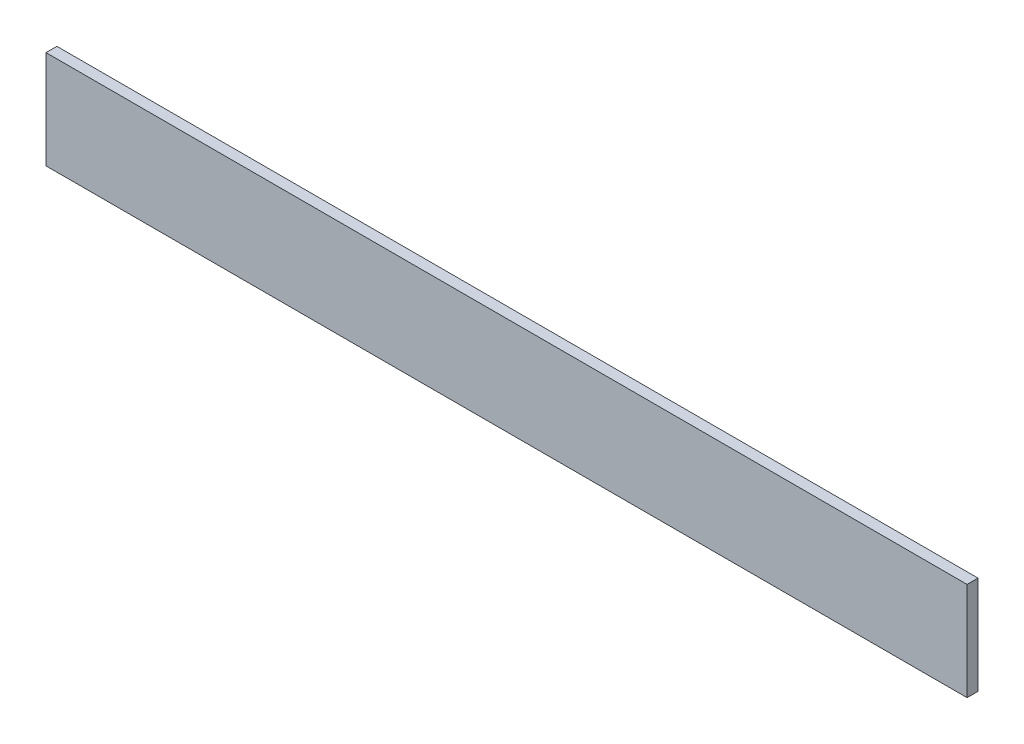
ISO-10303-21;
HEADER;
FILE_DESCRIPTION(('STEP AP214'),'2;1');
FILE_NAME('part.step','',(''),(''),'','','');
FILE_SCHEMA(('AUTOMOTIVE_DESIGN { 1 0 10303 214 1 1 1 1 }'));
ENDSEC;
DATA;
#1=APPLICATION_CONTEXT('core data for automotive mechanical design processes');
#2=APPLICATION_PROTOCOL_DEFINITION('international standard','automotive_design',2000,#1);
#3=PRODUCT_CONTEXT('',#1,'mechanical');
#4=PRODUCT('Part','Part','',(#3));
#5=PRODUCT_RELATED_PRODUCT_CATEGORY('part','',(#4));
#6=PRODUCT_DEFINITION_FORMATION('','',#4);
#7=PRODUCT_DEFINITION_CONTEXT('part definition',#1,'design');
#8=PRODUCT_DEFINITION('design','',#6,#7);
#9=PRODUCT_DEFINITION_SHAPE('','',#8);
#10=(LENGTH_UNIT() NAMED_UNIT(*) SI_UNIT(.MILLI.,.METRE.));
#11=(NAMED_UNIT(*) PLANE_ANGLE_UNIT() SI_UNIT($,.RADIAN.));
#12=(NAMED_UNIT(*) SI_UNIT($,.STERADIAN.) SOLID_ANGLE_UNIT());
#13=UNCERTAINTY_MEASURE_WITH_UNIT(LENGTH_MEASURE(1.E-05),#10,'distance_accuracy_value','');
#14=(GEOMETRIC_REPRESENTATION_CONTEXT(3) GLOBAL_UNCERTAINTY_ASSIGNED_CONTEXT((#13)) GLOBAL_UNIT_ASSIGNED_CONTEXT((#10,
#11,#12)) REPRESENTATION_CONTEXT('',''));
#15=CARTESIAN_POINT('',(0.,0.,0.));
#16=DIRECTION('',(0.,0.,1.));
#17=DIRECTION('',(1.,0.,0.));
#18=AXIS2_PLACEMENT_3D('',#15,#16,#17);
#19=CARTESIAN_POINT('',(84.5,8.99999999999962,2.00000000000047));
#20=DIRECTION('',(-1.,0.,0.));
#21=DIRECTION('',(0.,0.,1.00000000000001));
#22=AXIS2_PLACEMENT_3D('',#19,#20,#21);
#23=PLANE('',#22);
#24=DIRECTION('',(0.,1.00000000000001,0.));
#25=VECTOR('',#24,1.);
#26=CARTESIAN_POINT('',(84.5,8.99999999999882,4.44089209850063E-13));
#27=LINE('',#26,#25);
#28=CARTESIAN_POINT('',(84.5,-9.00000000000106,-3.33066907387547E-13));
#29=VERTEX_POINT('',#28);
#30=CARTESIAN_POINT('',(84.5,8.99999999999882,4.44089209850063E-13));
#31=VERTEX_POINT('',#30);
#32=EDGE_CURVE('E100',#29,#31,#27,.T.);
#33=ORIENTED_EDGE('',*,*,#32,.T.);
#34=DIRECTION('',(0.,0.,-1.00000000000001));
#35=VECTOR('',#34,1.);
#36=CARTESIAN_POINT('',(84.5,8.99999999999962,2.00000000000047));
#37=LINE('',#36,#35);
#38=CARTESIAN_POINT('',(84.5,8.99999999999962,2.00000000000047));
#39=VERTEX_POINT('',#38);
#40=EDGE_CURVE('E11',#39,#31,#37,.T.);
#41=ORIENTED_EDGE('',*,*,#40,.F.);
#42=DIRECTION('',(0.,1.00000000000001,0.));
#43=VECTOR('',#42,1.);
#44=CARTESIAN_POINT('',(84.5,8.99999999999962,2.00000000000047));
#45=LINE('',#44,#43);
#46=CARTESIAN_POINT('',(84.5,-9.00000000000048,2.00000000000006));
#47=VERTEX_POINT('',#46);
#48=EDGE_CURVE('E88',#47,#39,#45,.T.);
#49=ORIENTED_EDGE('',*,*,#48,.F.);
#50=DIRECTION('',(0.,0.,-1.00000000000001));
#51=VECTOR('',#50,1.);
#52=CARTESIAN_POINT('',(84.5,-9.00000000000048,2.00000000000006));
#53=LINE('',#52,#51);
#54=EDGE_CURVE('E96',#47,#29,#53,.T.);
#55=ORIENTED_EDGE('',*,*,#54,.T.);
#56=EDGE_LOOP('',(#33,#41,#49,#55));
#57=FACE_BOUND('',#56,.T.);
#58=ADVANCED_FACE('F37',(#57),#23,.F.);
#59=CARTESIAN_POINT('',(-84.5000000000001,8.99999999999951,2.00000000000009));
#60=DIRECTION('',(0.,-1.00000000000001,0.));
#61=DIRECTION('',(0.,0.,-1.00000000000001));
#62=AXIS2_PLACEMENT_3D('',#59,#60,#61);
#63=PLANE('',#62);
#64=DIRECTION('',(-1.,0.,0.));
#65=VECTOR('',#64,1.);
#66=CARTESIAN_POINT('',(-84.5,8.99999999999848,2.22044604925031E-13));
#67=LINE('',#66,#65);
#68=CARTESIAN_POINT('',(-84.5,8.99999999999848,2.22044604925031E-13));
#69=VERTEX_POINT('',#68);
#70=EDGE_CURVE('E92',#31,#69,#67,.T.);
#71=ORIENTED_EDGE('',*,*,#70,.T.);
#72=DIRECTION('',(0.,0.,-1.00000000000001));
#73=VECTOR('',#72,1.);
#74=CARTESIAN_POINT('',(-84.5000000000001,8.99999999999951,2.00000000000009));
#75=LINE('',#74,#73);
#76=CARTESIAN_POINT('',(-84.5000000000001,8.99999999999951,2.00000000000009));
#77=VERTEX_POINT('',#76);
#78=EDGE_CURVE('E45',#77,#69,#75,.T.);
#79=ORIENTED_EDGE('',*,*,#78,.F.);
#80=DIRECTION('',(-1.,0.,0.));
#81=VECTOR('',#80,1.);
#82=CARTESIAN_POINT('',(-84.5000000000001,8.99999999999951,2.00000000000009));
#83=LINE('',#82,#81);
#84=EDGE_CURVE('E83',#39,#77,#83,.T.);
#85=ORIENTED_EDGE('',*,*,#84,.F.);
#86=ORIENTED_EDGE('',*,*,#40,.T.);
#87=EDGE_LOOP('',(#71,#79,#85,#86));
#88=FACE_BOUND('',#87,.T.);
#89=ADVANCED_FACE('F91',(#88),#63,.F.);
#90=CARTESIAN_POINT('',(-84.5000000000001,8.99999999999951,2.00000000000009));
#91=DIRECTION('',(1.,0.,0.));
#92=DIRECTION('',(0.,0.,-1.00000000000001));
#93=AXIS2_PLACEMENT_3D('',#90,#91,#92);
#94=PLANE('',#93);
#95=DIRECTION('',(0.,-1.00000000000001,0.));
#96=VECTOR('',#95,1.);
#97=CARTESIAN_POINT('',(-84.5,8.99999999999848,2.22044604925031E-13));
#98=LINE('',#97,#96);
#99=CARTESIAN_POINT('',(-84.5,-9.00000000000112,-4.44089209850063E-13));
#100=VERTEX_POINT('',#99);
#101=EDGE_CURVE('E70',#69,#100,#98,.T.);
#102=ORIENTED_EDGE('',*,*,#101,.T.);
#103=DIRECTION('',(0.,0.,-1.00000000000001));
#104=VECTOR('',#103,1.);
#105=CARTESIAN_POINT('',(-84.5,-9.00000000000053,1.99999999999989));
#106=LINE('',#105,#104);
#107=CARTESIAN_POINT('',(-84.5,-9.00000000000053,1.99999999999989));
#108=VERTEX_POINT('',#107);
#109=EDGE_CURVE('E93',#108,#100,#106,.T.);
#110=ORIENTED_EDGE('',*,*,#109,.F.);
#111=DIRECTION('',(0.,-1.00000000000001,0.));
#112=VECTOR('',#111,1.);
#113=CARTESIAN_POINT('',(-84.5000000000001,8.99999999999951,2.00000000000009));
#114=LINE('',#113,#112);
#115=EDGE_CURVE('E86',#77,#108,#114,.T.);
#116=ORIENTED_EDGE('',*,*,#115,.F.);
#117=ORIENTED_EDGE('',*,*,#78,.T.);
#118=EDGE_LOOP('',(#102,#110,#116,#117));
#119=FACE_BOUND('',#118,.T.);
#120=ADVANCED_FACE('F94',(#119),#94,.F.);
#121=CARTESIAN_POINT('',(-84.5,-9.00000000000053,1.99999999999989));
#122=DIRECTION('',(0.,1.00000000000001,0.));
#123=DIRECTION('',(0.,0.,1.00000000000001));
#124=AXIS2_PLACEMENT_3D('',#121,#122,#123);
#125=PLANE('',#124);
#126=DIRECTION('',(1.,0.,0.));
#127=VECTOR('',#126,1.);
#128=CARTESIAN_POINT('',(-84.5,-9.00000000000112,-4.44089209850063E-13));
#129=LINE('',#128,#127);
#130=EDGE_CURVE('E76',#100,#29,#129,.T.);
#131=ORIENTED_EDGE('',*,*,#130,.T.);
#132=ORIENTED_EDGE('',*,*,#54,.F.);
#133=DIRECTION('',(1.,0.,0.));
#134=VECTOR('',#133,1.);
#135=CARTESIAN_POINT('',(-84.5,-9.00000000000053,1.99999999999989));
#136=LINE('',#135,#134);
#137=EDGE_CURVE('E53',#108,#47,#136,.T.);
#138=ORIENTED_EDGE('',*,*,#137,.F.);
#139=ORIENTED_EDGE('',*,*,#109,.T.);
#140=EDGE_LOOP('',(#131,#132,#138,#139));
#141=FACE_BOUND('',#140,.T.);
#142=ADVANCED_FACE('F107',(#141),#125,.F.);
#143=CARTESIAN_POINT('',(0.,-5.55111512312578E-13,1.99999999999995));
#144=DIRECTION('',(0.,0.,1.00000000000001));
#145=DIRECTION('',(1.,0.,0.));
#146=AXIS2_PLACEMENT_3D('',#143,#144,#145);
#147=PLANE('',#146);
#148=ORIENTED_EDGE('',*,*,#48,.T.);
#149=ORIENTED_EDGE('',*,*,#84,.T.);
#150=ORIENTED_EDGE('',*,*,#115,.T.);
#151=ORIENTED_EDGE('',*,*,#137,.T.);
#152=EDGE_LOOP('',(#148,#149,#150,#151));
#153=FACE_BOUND('',#152,.T.);
#154=ADVANCED_FACE('F84',(#153),#147,.T.);
#155=CARTESIAN_POINT('',(0.,0.,0.));
#156=DIRECTION('',(0.,0.,1.00000000000001));
#157=DIRECTION('',(1.,0.,0.));
#158=AXIS2_PLACEMENT_3D('',#155,#156,#157);
#159=PLANE('',#158);
#160=ORIENTED_EDGE('',*,*,#32,.F.);
#161=ORIENTED_EDGE('',*,*,#130,.F.);
#162=ORIENTED_EDGE('',*,*,#101,.F.);
#163=ORIENTED_EDGE('',*,*,#70,.F.);
#164=EDGE_LOOP('',(#160,#161,#162,#163));
#165=FACE_BOUND('',#164,.T.);
#166=ADVANCED_FACE('F110',(#165),#159,.F.);
#167=CLOSED_SHELL('',(#58,#89,#120,#142,#154,#166));
#168=MANIFOLD_SOLID_BREP('B2',#167);
#169=ADVANCED_BREP_SHAPE_REPRESENTATION('',(#18,#168),#14);
#170=SHAPE_DEFINITION_REPRESENTATION(#9,#169);
ENDSEC;
END-ISO-10303-21;
